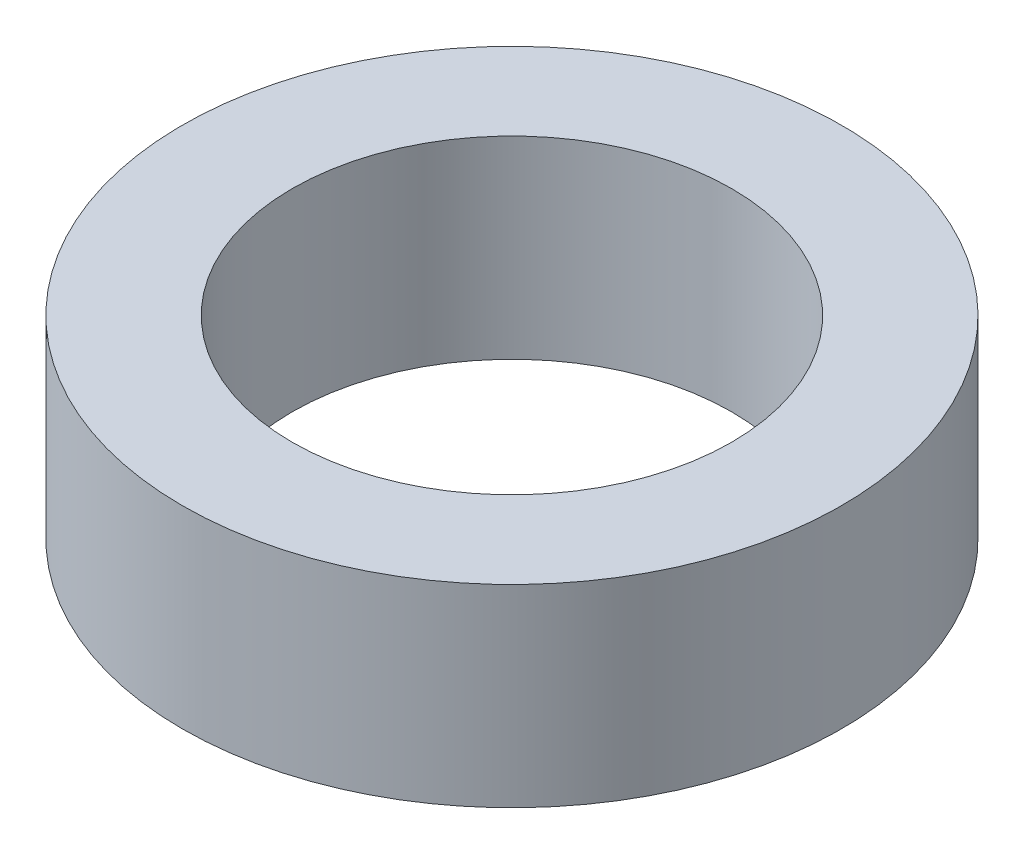
ISO-10303-21;
HEADER;
FILE_DESCRIPTION(('STEP AP214'),'2;1');
FILE_NAME('part.step','',(''),(''),'','','');
FILE_SCHEMA(('AUTOMOTIVE_DESIGN { 1 0 10303 214 1 1 1 1 }'));
ENDSEC;
DATA;
#1=APPLICATION_CONTEXT('core data for automotive mechanical design processes');
#2=APPLICATION_PROTOCOL_DEFINITION('international standard','automotive_design',2000,#1);
#3=PRODUCT_CONTEXT('',#1,'mechanical');
#4=PRODUCT('Part','Part','',(#3));
#5=PRODUCT_RELATED_PRODUCT_CATEGORY('part','',(#4));
#6=PRODUCT_DEFINITION_FORMATION('','',#4);
#7=PRODUCT_DEFINITION_CONTEXT('part definition',#1,'design');
#8=PRODUCT_DEFINITION('design','',#6,#7);
#9=PRODUCT_DEFINITION_SHAPE('','',#8);
#10=(LENGTH_UNIT() NAMED_UNIT(*) SI_UNIT(.MILLI.,.METRE.));
#11=(NAMED_UNIT(*) PLANE_ANGLE_UNIT() SI_UNIT($,.RADIAN.));
#12=(NAMED_UNIT(*) SI_UNIT($,.STERADIAN.) SOLID_ANGLE_UNIT());
#13=UNCERTAINTY_MEASURE_WITH_UNIT(LENGTH_MEASURE(1.E-05),#10,'distance_accuracy_value','');
#14=(GEOMETRIC_REPRESENTATION_CONTEXT(3) GLOBAL_UNCERTAINTY_ASSIGNED_CONTEXT((#13)) GLOBAL_UNIT_ASSIGNED_CONTEXT((#10,
#11,#12)) REPRESENTATION_CONTEXT('',''));
#15=CARTESIAN_POINT('',(0.,0.,0.));
#16=DIRECTION('',(0.,0.,1.));
#17=DIRECTION('',(1.,0.,0.));
#18=AXIS2_PLACEMENT_3D('',#15,#16,#17);
#19=CARTESIAN_POINT('',(0.,5.588,0.));
#20=DIRECTION('',(0.,1.,0.));
#21=DIRECTION('',(0.,0.,1.));
#22=AXIS2_PLACEMENT_3D('',#19,#20,#21);
#23=PLANE('',#22);
#24=CARTESIAN_POINT('',(0.,5.588,0.));
#25=DIRECTION('',(0.,1.,0.));
#26=DIRECTION('',(0.,0.,1.));
#27=AXIS2_PLACEMENT_3D('',#24,#25,#26);
#28=CIRCLE('',#27,9.52500000000001);
#29=CARTESIAN_POINT('',(0.,5.588,9.52500000000001));
#30=VERTEX_POINT('',#29);
#31=EDGE_CURVE('E10',#30,#30,#28,.T.);
#32=ORIENTED_EDGE('',*,*,#31,.T.);
#33=EDGE_LOOP('',(#32));
#34=FACE_BOUND('',#33,.T.);
#35=CARTESIAN_POINT('',(0.,5.588,0.));
#36=DIRECTION('',(0.,1.,0.));
#37=DIRECTION('',(0.,0.,1.));
#38=AXIS2_PLACEMENT_3D('',#35,#36,#37);
#39=CIRCLE('',#38,6.35);
#40=CARTESIAN_POINT('',(0.,5.588,6.35));
#41=VERTEX_POINT('',#40);
#42=EDGE_CURVE('E42',#41,#41,#39,.T.);
#43=ORIENTED_EDGE('',*,*,#42,.F.);
#44=EDGE_LOOP('',(#43));
#45=FACE_BOUND('',#44,.T.);
#46=ADVANCED_FACE('F31',(#34,#45),#23,.T.);
#47=CARTESIAN_POINT('',(0.,0.,0.));
#48=DIRECTION('',(0.,1.,0.));
#49=DIRECTION('',(0.,0.,1.));
#50=AXIS2_PLACEMENT_3D('',#47,#48,#49);
#51=PLANE('',#50);
#52=CARTESIAN_POINT('',(0.,0.,0.));
#53=DIRECTION('',(0.,1.,0.));
#54=DIRECTION('',(0.,0.,1.));
#55=AXIS2_PLACEMENT_3D('',#52,#53,#54);
#56=CIRCLE('',#55,9.52500000000001);
#57=CARTESIAN_POINT('',(0.,0.,9.52500000000001));
#58=VERTEX_POINT('',#57);
#59=EDGE_CURVE('E35',#58,#58,#56,.T.);
#60=ORIENTED_EDGE('',*,*,#59,.F.);
#61=EDGE_LOOP('',(#60));
#62=FACE_BOUND('',#61,.T.);
#63=CARTESIAN_POINT('',(0.,0.,0.));
#64=DIRECTION('',(0.,1.,0.));
#65=DIRECTION('',(0.,0.,1.));
#66=AXIS2_PLACEMENT_3D('',#63,#64,#65);
#67=CIRCLE('',#66,6.35);
#68=CARTESIAN_POINT('',(0.,0.,6.35));
#69=VERTEX_POINT('',#68);
#70=EDGE_CURVE('E44',#69,#69,#67,.T.);
#71=ORIENTED_EDGE('',*,*,#70,.T.);
#72=EDGE_LOOP('',(#71));
#73=FACE_BOUND('',#72,.T.);
#74=ADVANCED_FACE('F54',(#62,#73),#51,.F.);
#75=CARTESIAN_POINT('',(0.,5.588,0.));
#76=DIRECTION('',(0.,-1.,0.));
#77=DIRECTION('',(0.,0.,-1.));
#78=AXIS2_PLACEMENT_3D('',#75,#76,#77);
#79=CYLINDRICAL_SURFACE('',#78,9.52500000000001);
#80=ORIENTED_EDGE('',*,*,#31,.F.);
#81=EDGE_LOOP('',(#80));
#82=FACE_BOUND('',#81,.T.);
#83=ORIENTED_EDGE('',*,*,#59,.T.);
#84=EDGE_LOOP('',(#83));
#85=FACE_BOUND('',#84,.T.);
#86=ADVANCED_FACE('F33',(#82,#85),#79,.T.);
#87=CARTESIAN_POINT('',(0.,5.588,0.));
#88=DIRECTION('',(0.,-1.,0.));
#89=DIRECTION('',(0.,0.,-1.));
#90=AXIS2_PLACEMENT_3D('',#87,#88,#89);
#91=CYLINDRICAL_SURFACE('',#90,6.35);
#92=ORIENTED_EDGE('',*,*,#42,.T.);
#93=EDGE_LOOP('',(#92));
#94=FACE_BOUND('',#93,.T.);
#95=ORIENTED_EDGE('',*,*,#70,.F.);
#96=EDGE_LOOP('',(#95));
#97=FACE_BOUND('',#96,.T.);
#98=ADVANCED_FACE('F50',(#94,#97),#91,.F.);
#99=CLOSED_SHELL('',(#46,#74,#86,#98));
#100=MANIFOLD_SOLID_BREP('B2',#99);
#101=ADVANCED_BREP_SHAPE_REPRESENTATION('',(#18,#100),#14);
#102=SHAPE_DEFINITION_REPRESENTATION(#9,#101);
ENDSEC;
END-ISO-10303-21;
